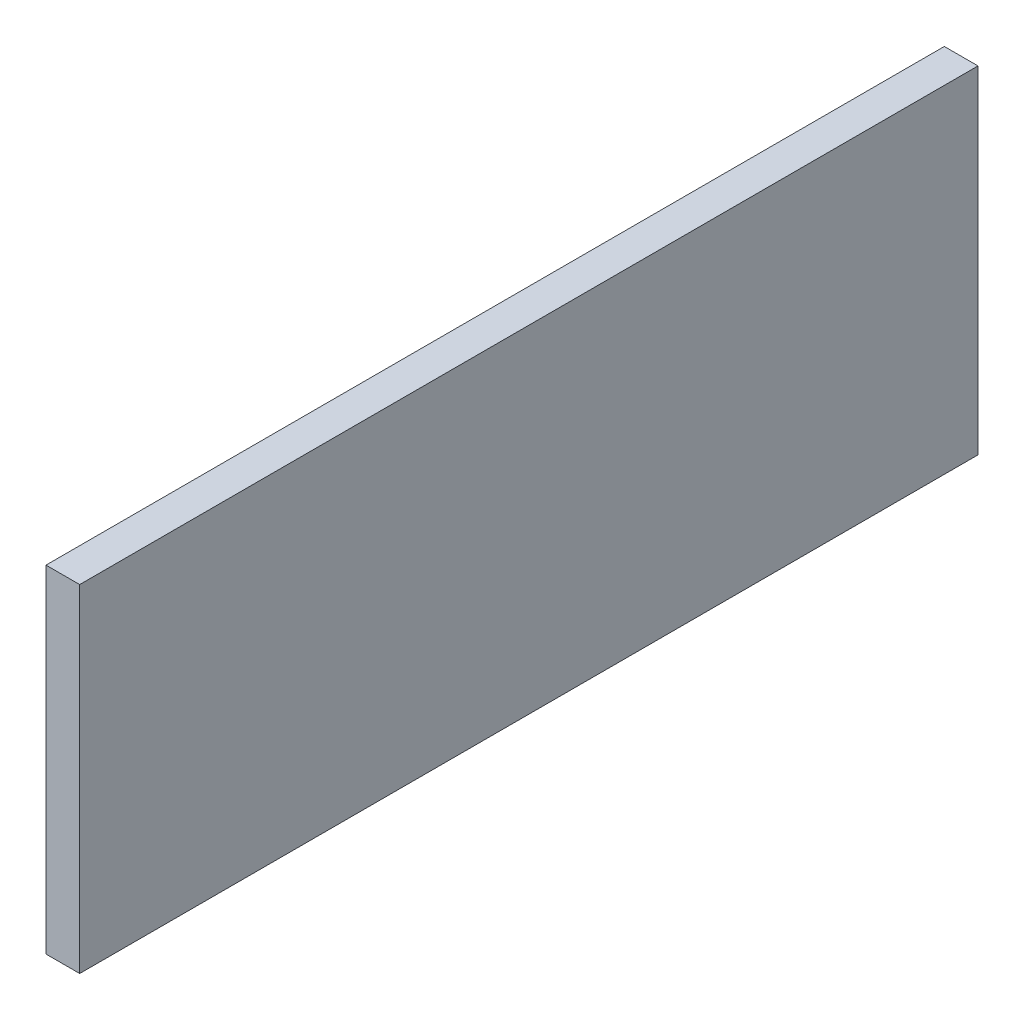
ISO-10303-21;
HEADER;
FILE_DESCRIPTION(('STEP AP214'),'2;1');
FILE_NAME('part.step','',(''),(''),'','','');
FILE_SCHEMA(('AUTOMOTIVE_DESIGN { 1 0 10303 214 1 1 1 1 }'));
ENDSEC;
DATA;
#1=APPLICATION_CONTEXT('core data for automotive mechanical design processes');
#2=APPLICATION_PROTOCOL_DEFINITION('international standard','automotive_design',2000,#1);
#3=PRODUCT_CONTEXT('',#1,'mechanical');
#4=PRODUCT('Part','Part','',(#3));
#5=PRODUCT_RELATED_PRODUCT_CATEGORY('part','',(#4));
#6=PRODUCT_DEFINITION_FORMATION('','',#4);
#7=PRODUCT_DEFINITION_CONTEXT('part definition',#1,'design');
#8=PRODUCT_DEFINITION('design','',#6,#7);
#9=PRODUCT_DEFINITION_SHAPE('','',#8);
#10=(LENGTH_UNIT() NAMED_UNIT(*) SI_UNIT(.MILLI.,.METRE.));
#11=(NAMED_UNIT(*) PLANE_ANGLE_UNIT() SI_UNIT($,.RADIAN.));
#12=(NAMED_UNIT(*) SI_UNIT($,.STERADIAN.) SOLID_ANGLE_UNIT());
#13=UNCERTAINTY_MEASURE_WITH_UNIT(LENGTH_MEASURE(1.E-05),#10,'distance_accuracy_value','');
#14=(GEOMETRIC_REPRESENTATION_CONTEXT(3) GLOBAL_UNCERTAINTY_ASSIGNED_CONTEXT((#13)) GLOBAL_UNIT_ASSIGNED_CONTEXT((#10,
#11,#12)) REPRESENTATION_CONTEXT('',''));
#15=CARTESIAN_POINT('',(0.,0.,0.));
#16=DIRECTION('',(0.,0.,1.));
#17=DIRECTION('',(1.,0.,0.));
#18=AXIS2_PLACEMENT_3D('',#15,#16,#17);
#19=CARTESIAN_POINT('',(3.,33.879952224077,34.1984732824427));
#20=DIRECTION('',(0.,0.,-1.));
#21=DIRECTION('',(0.,1.,0.));
#22=AXIS2_PLACEMENT_3D('',#19,#20,#21);
#23=PLANE('',#22);
#24=DIRECTION('',(0.,-1.,0.));
#25=VECTOR('',#24,1.);
#26=CARTESIAN_POINT('',(0.,33.879952224077,34.1984732824427));
#27=LINE('',#26,#25);
#28=CARTESIAN_POINT('',(0.,33.879952224077,34.1984732824427));
#29=VERTEX_POINT('',#28);
#30=CARTESIAN_POINT('',(0.,3.87995222407696,34.1984732824427));
#31=VERTEX_POINT('',#30);
#32=EDGE_CURVE('E96',#29,#31,#27,.T.);
#33=ORIENTED_EDGE('',*,*,#32,.T.);
#34=DIRECTION('',(-1.,0.,0.));
#35=VECTOR('',#34,1.);
#36=CARTESIAN_POINT('',(3.,3.87995222407696,34.1984732824427));
#37=LINE('',#36,#35);
#38=CARTESIAN_POINT('',(3.,3.87995222407696,34.1984732824427));
#39=VERTEX_POINT('',#38);
#40=EDGE_CURVE('E11',#39,#31,#37,.T.);
#41=ORIENTED_EDGE('',*,*,#40,.F.);
#42=DIRECTION('',(0.,-1.,0.));
#43=VECTOR('',#42,1.);
#44=CARTESIAN_POINT('',(3.,33.879952224077,34.1984732824427));
#45=LINE('',#44,#43);
#46=CARTESIAN_POINT('',(3.,33.879952224077,34.1984732824427));
#47=VERTEX_POINT('',#46);
#48=EDGE_CURVE('E84',#47,#39,#45,.T.);
#49=ORIENTED_EDGE('',*,*,#48,.F.);
#50=DIRECTION('',(-1.,0.,0.));
#51=VECTOR('',#50,1.);
#52=CARTESIAN_POINT('',(3.,33.879952224077,34.1984732824427));
#53=LINE('',#52,#51);
#54=EDGE_CURVE('E92',#47,#29,#53,.T.);
#55=ORIENTED_EDGE('',*,*,#54,.T.);
#56=EDGE_LOOP('',(#33,#41,#49,#55));
#57=FACE_BOUND('',#56,.T.);
#58=ADVANCED_FACE('F33',(#57),#23,.F.);
#59=CARTESIAN_POINT('',(3.,3.87995222407696,34.1984732824427));
#60=DIRECTION('',(0.,1.,0.));
#61=DIRECTION('',(0.,0.,1.));
#62=AXIS2_PLACEMENT_3D('',#59,#60,#61);
#63=PLANE('',#62);
#64=DIRECTION('',(0.,0.,-1.));
#65=VECTOR('',#64,1.);
#66=CARTESIAN_POINT('',(0.,3.87995222407696,34.1984732824427));
#67=LINE('',#66,#65);
#68=CARTESIAN_POINT('',(0.,3.87995222407696,-45.8015267175573));
#69=VERTEX_POINT('',#68);
#70=EDGE_CURVE('E88',#31,#69,#67,.T.);
#71=ORIENTED_EDGE('',*,*,#70,.T.);
#72=DIRECTION('',(-1.,0.,0.));
#73=VECTOR('',#72,1.);
#74=CARTESIAN_POINT('',(3.,3.87995222407696,-45.8015267175573));
#75=LINE('',#74,#73);
#76=CARTESIAN_POINT('',(3.,3.87995222407696,-45.8015267175573));
#77=VERTEX_POINT('',#76);
#78=EDGE_CURVE('E41',#77,#69,#75,.T.);
#79=ORIENTED_EDGE('',*,*,#78,.F.);
#80=DIRECTION('',(0.,0.,-1.));
#81=VECTOR('',#80,1.);
#82=CARTESIAN_POINT('',(3.,3.87995222407696,34.1984732824427));
#83=LINE('',#82,#81);
#84=EDGE_CURVE('E79',#39,#77,#83,.T.);
#85=ORIENTED_EDGE('',*,*,#84,.F.);
#86=ORIENTED_EDGE('',*,*,#40,.T.);
#87=EDGE_LOOP('',(#71,#79,#85,#86));
#88=FACE_BOUND('',#87,.T.);
#89=ADVANCED_FACE('F87',(#88),#63,.F.);
#90=CARTESIAN_POINT('',(3.,33.879952224077,-45.8015267175573));
#91=DIRECTION('',(0.,0.,1.));
#92=DIRECTION('',(1.,0.,0.));
#93=AXIS2_PLACEMENT_3D('',#90,#91,#92);
#94=PLANE('',#93);
#95=DIRECTION('',(0.,1.,0.));
#96=VECTOR('',#95,1.);
#97=CARTESIAN_POINT('',(0.,33.879952224077,-45.8015267175573));
#98=LINE('',#97,#96);
#99=CARTESIAN_POINT('',(0.,33.879952224077,-45.8015267175573));
#100=VERTEX_POINT('',#99);
#101=EDGE_CURVE('E66',#69,#100,#98,.T.);
#102=ORIENTED_EDGE('',*,*,#101,.T.);
#103=DIRECTION('',(-1.,0.,0.));
#104=VECTOR('',#103,1.);
#105=CARTESIAN_POINT('',(3.,33.879952224077,-45.8015267175573));
#106=LINE('',#105,#104);
#107=CARTESIAN_POINT('',(3.,33.879952224077,-45.8015267175573));
#108=VERTEX_POINT('',#107);
#109=EDGE_CURVE('E89',#108,#100,#106,.T.);
#110=ORIENTED_EDGE('',*,*,#109,.F.);
#111=DIRECTION('',(0.,1.,0.));
#112=VECTOR('',#111,1.);
#113=CARTESIAN_POINT('',(3.,33.879952224077,-45.8015267175573));
#114=LINE('',#113,#112);
#115=EDGE_CURVE('E82',#77,#108,#114,.T.);
#116=ORIENTED_EDGE('',*,*,#115,.F.);
#117=ORIENTED_EDGE('',*,*,#78,.T.);
#118=EDGE_LOOP('',(#102,#110,#116,#117));
#119=FACE_BOUND('',#118,.T.);
#120=ADVANCED_FACE('F90',(#119),#94,.F.);
#121=CARTESIAN_POINT('',(3.,33.879952224077,34.1984732824427));
#122=DIRECTION('',(0.,-1.,0.));
#123=DIRECTION('',(0.,0.,-1.));
#124=AXIS2_PLACEMENT_3D('',#121,#122,#123);
#125=PLANE('',#124);
#126=DIRECTION('',(0.,0.,1.));
#127=VECTOR('',#126,1.);
#128=CARTESIAN_POINT('',(0.,33.879952224077,34.1984732824427));
#129=LINE('',#128,#127);
#130=EDGE_CURVE('E72',#100,#29,#129,.T.);
#131=ORIENTED_EDGE('',*,*,#130,.T.);
#132=ORIENTED_EDGE('',*,*,#54,.F.);
#133=DIRECTION('',(0.,0.,1.));
#134=VECTOR('',#133,1.);
#135=CARTESIAN_POINT('',(3.,33.879952224077,34.1984732824427));
#136=LINE('',#135,#134);
#137=EDGE_CURVE('E49',#108,#47,#136,.T.);
#138=ORIENTED_EDGE('',*,*,#137,.F.);
#139=ORIENTED_EDGE('',*,*,#109,.T.);
#140=EDGE_LOOP('',(#131,#132,#138,#139));
#141=FACE_BOUND('',#140,.T.);
#142=ADVANCED_FACE('F103',(#141),#125,.F.);
#143=CARTESIAN_POINT('',(3.,0.,0.));
#144=DIRECTION('',(1.,0.,0.));
#145=DIRECTION('',(0.,0.,-1.));
#146=AXIS2_PLACEMENT_3D('',#143,#144,#145);
#147=PLANE('',#146);
#148=ORIENTED_EDGE('',*,*,#48,.T.);
#149=ORIENTED_EDGE('',*,*,#84,.T.);
#150=ORIENTED_EDGE('',*,*,#115,.T.);
#151=ORIENTED_EDGE('',*,*,#137,.T.);
#152=EDGE_LOOP('',(#148,#149,#150,#151));
#153=FACE_BOUND('',#152,.T.);
#154=ADVANCED_FACE('F80',(#153),#147,.T.);
#155=CARTESIAN_POINT('',(0.,0.,0.));
#156=DIRECTION('',(1.,0.,0.));
#157=DIRECTION('',(0.,0.,-1.));
#158=AXIS2_PLACEMENT_3D('',#155,#156,#157);
#159=PLANE('',#158);
#160=ORIENTED_EDGE('',*,*,#32,.F.);
#161=ORIENTED_EDGE('',*,*,#130,.F.);
#162=ORIENTED_EDGE('',*,*,#101,.F.);
#163=ORIENTED_EDGE('',*,*,#70,.F.);
#164=EDGE_LOOP('',(#160,#161,#162,#163));
#165=FACE_BOUND('',#164,.T.);
#166=ADVANCED_FACE('F106',(#165),#159,.F.);
#167=CLOSED_SHELL('',(#58,#89,#120,#142,#154,#166));
#168=MANIFOLD_SOLID_BREP('B2',#167);
#169=ADVANCED_BREP_SHAPE_REPRESENTATION('',(#18,#168),#14);
#170=SHAPE_DEFINITION_REPRESENTATION(#9,#169);
ENDSEC;
END-ISO-10303-21;
